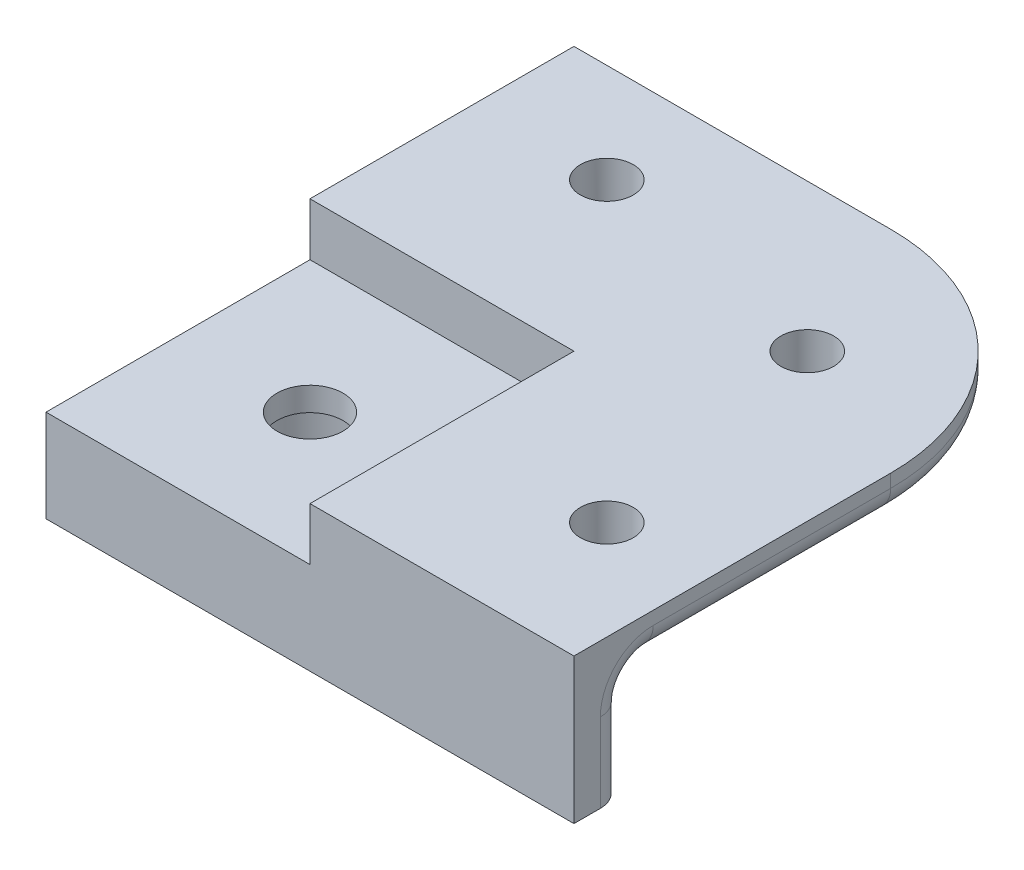
ISO-10303-21;
HEADER;
FILE_DESCRIPTION(('STEP AP214'),'2;1');
FILE_NAME('part.step','',(''),(''),'','','');
FILE_SCHEMA(('AUTOMOTIVE_DESIGN { 1 0 10303 214 1 1 1 1 }'));
ENDSEC;
DATA;
#1=APPLICATION_CONTEXT('core data for automotive mechanical design processes');
#2=APPLICATION_PROTOCOL_DEFINITION('international standard','automotive_design',2000,#1);
#3=PRODUCT_CONTEXT('',#1,'mechanical');
#4=PRODUCT('Part','Part','',(#3));
#5=PRODUCT_RELATED_PRODUCT_CATEGORY('part','',(#4));
#6=PRODUCT_DEFINITION_FORMATION('','',#4);
#7=PRODUCT_DEFINITION_CONTEXT('part definition',#1,'design');
#8=PRODUCT_DEFINITION('design','',#6,#7);
#9=PRODUCT_DEFINITION_SHAPE('','',#8);
#10=(LENGTH_UNIT() NAMED_UNIT(*) SI_UNIT(.MILLI.,.METRE.));
#11=(NAMED_UNIT(*) PLANE_ANGLE_UNIT() SI_UNIT($,.RADIAN.));
#12=(NAMED_UNIT(*) SI_UNIT($,.STERADIAN.) SOLID_ANGLE_UNIT());
#13=UNCERTAINTY_MEASURE_WITH_UNIT(LENGTH_MEASURE(1.E-05),#10,'distance_accuracy_value','');
#14=(GEOMETRIC_REPRESENTATION_CONTEXT(3) GLOBAL_UNCERTAINTY_ASSIGNED_CONTEXT((#13)) GLOBAL_UNIT_ASSIGNED_CONTEXT((#10,
#11,#12)) REPRESENTATION_CONTEXT('',''));
#15=CARTESIAN_POINT('',(0.,0.,0.));
#16=DIRECTION('',(0.,0.,1.));
#17=DIRECTION('',(1.,0.,0.));
#18=AXIS2_PLACEMENT_3D('',#15,#16,#17);
#19=CARTESIAN_POINT('',(0.,10.,0.));
#20=DIRECTION('',(0.,-1.,0.));
#21=DIRECTION('',(0.,0.,-1.));
#22=AXIS2_PLACEMENT_3D('',#19,#20,#21);
#23=CYLINDRICAL_SURFACE('',#22,2.5);
#24=CARTESIAN_POINT('',(0.,7.,0.));
#25=DIRECTION('',(0.,-1.,0.));
#26=DIRECTION('',(0.,0.,-1.));
#27=AXIS2_PLACEMENT_3D('',#24,#25,#26);
#28=CIRCLE('',#27,2.5);
#29=CARTESIAN_POINT('',(0.,7.,-2.5));
#30=VERTEX_POINT('',#29);
#31=EDGE_CURVE('E351',#30,#30,#28,.T.);
#32=ORIENTED_EDGE('',*,*,#31,.F.);
#33=EDGE_LOOP('',(#32));
#34=FACE_BOUND('',#33,.T.);
#35=CARTESIAN_POINT('',(0.,5.2,0.));
#36=DIRECTION('',(0.,-1.,0.));
#37=DIRECTION('',(0.,0.,-1.));
#38=AXIS2_PLACEMENT_3D('',#35,#36,#37);
#39=CIRCLE('',#38,2.5);
#40=CARTESIAN_POINT('',(0.,5.2,-2.5));
#41=VERTEX_POINT('',#40);
#42=EDGE_CURVE('E396',#41,#41,#39,.F.);
#43=ORIENTED_EDGE('',*,*,#42,.F.);
#44=EDGE_LOOP('',(#43));
#45=FACE_BOUND('',#44,.T.);
#46=ADVANCED_FACE('F34',(#34,#45),#23,.F.);
#47=CARTESIAN_POINT('',(0.,11.,6.));
#48=DIRECTION('',(0.,0.,-1.));
#49=DIRECTION('',(-1.,0.,0.));
#50=AXIS2_PLACEMENT_3D('',#47,#48,#49);
#51=PLANE('',#50);
#52=DIRECTION('',(-1.,0.,0.));
#53=VECTOR('',#52,1.);
#54=CARTESIAN_POINT('',(0.,6.,6.));
#55=LINE('',#54,#53);
#56=CARTESIAN_POINT('',(16.,6.,6.));
#57=VERTEX_POINT('',#56);
#58=CARTESIAN_POINT('',(28.,6.,6.));
#59=VERTEX_POINT('',#58);
#60=EDGE_CURVE('E286',#57,#59,#55,.F.);
#61=ORIENTED_EDGE('',*,*,#60,.T.);
#62=DIRECTION('',(0.,-1.,0.));
#63=VECTOR('',#62,1.);
#64=CARTESIAN_POINT('',(28.,0.,6.));
#65=LINE('',#64,#63);
#66=CARTESIAN_POINT('',(28.,0.,6.));
#67=VERTEX_POINT('',#66);
#68=EDGE_CURVE('E288',#59,#67,#65,.T.);
#69=ORIENTED_EDGE('',*,*,#68,.T.);
#70=DIRECTION('',(1.,0.,0.));
#71=VECTOR('',#70,1.);
#72=CARTESIAN_POINT('',(0.,0.,6.));
#73=LINE('',#72,#71);
#74=CARTESIAN_POINT('',(16.,0.,6.));
#75=VERTEX_POINT('',#74);
#76=EDGE_CURVE('E255',#75,#67,#73,.T.);
#77=ORIENTED_EDGE('',*,*,#76,.F.);
#78=DIRECTION('',(0.,-1.,0.));
#79=VECTOR('',#78,1.);
#80=CARTESIAN_POINT('',(16.,8.,6.));
#81=LINE('',#80,#79);
#82=EDGE_CURVE('E284',#75,#57,#81,.F.);
#83=ORIENTED_EDGE('',*,*,#82,.T.);
#84=EDGE_LOOP('',(#61,#69,#77,#83));
#85=FACE_BOUND('',#84,.T.);
#86=ADVANCED_FACE('F469',(#85),#51,.T.);
#87=CARTESIAN_POINT('',(14.,11.,0.));
#88=DIRECTION('',(1.,0.,0.));
#89=DIRECTION('',(0.,0.,-1.));
#90=AXIS2_PLACEMENT_3D('',#87,#88,#89);
#91=PLANE('',#90);
#92=DIRECTION('',(0.,0.,1.));
#93=VECTOR('',#92,1.);
#94=CARTESIAN_POINT('',(14.,0.,0.));
#95=LINE('',#94,#93);
#96=CARTESIAN_POINT('',(14.,0.,-12.));
#97=VERTEX_POINT('',#96);
#98=CARTESIAN_POINT('',(14.,0.,4.));
#99=VERTEX_POINT('',#98);
#100=EDGE_CURVE('E258',#97,#99,#95,.T.);
#101=ORIENTED_EDGE('',*,*,#100,.F.);
#102=DIRECTION('',(0.,-1.,0.));
#103=VECTOR('',#102,1.);
#104=CARTESIAN_POINT('',(14.,11.,-12.));
#105=LINE('',#104,#103);
#106=CARTESIAN_POINT('',(14.,6.,-12.));
#107=VERTEX_POINT('',#106);
#108=EDGE_CURVE('E338',#97,#107,#105,.F.);
#109=ORIENTED_EDGE('',*,*,#108,.T.);
#110=DIRECTION('',(0.,0.,-1.));
#111=VECTOR('',#110,1.);
#112=CARTESIAN_POINT('',(14.,6.,0.));
#113=LINE('',#112,#111);
#114=CARTESIAN_POINT('',(14.,6.,4.));
#115=VERTEX_POINT('',#114);
#116=EDGE_CURVE('E336',#107,#115,#113,.F.);
#117=ORIENTED_EDGE('',*,*,#116,.T.);
#118=DIRECTION('',(0.,-1.,0.));
#119=VECTOR('',#118,1.);
#120=CARTESIAN_POINT('',(14.,0.,4.));
#121=LINE('',#120,#119);
#122=EDGE_CURVE('E334',#115,#99,#121,.T.);
#123=ORIENTED_EDGE('',*,*,#122,.T.);
#124=EDGE_LOOP('',(#101,#109,#117,#123));
#125=FACE_BOUND('',#124,.T.);
#126=ADVANCED_FACE('F479',(#125),#91,.T.);
#127=CARTESIAN_POINT('',(0.,11.,-14.));
#128=DIRECTION('',(0.,0.,-1.));
#129=DIRECTION('',(-1.,0.,0.));
#130=AXIS2_PLACEMENT_3D('',#127,#128,#129);
#131=PLANE('',#130);
#132=DIRECTION('',(1.,0.,0.));
#133=VECTOR('',#132,1.);
#134=CARTESIAN_POINT('',(0.,0.,-14.));
#135=LINE('',#134,#133);
#136=CARTESIAN_POINT('',(-4.,0.,-14.));
#137=VERTEX_POINT('',#136);
#138=CARTESIAN_POINT('',(12.,0.,-14.));
#139=VERTEX_POINT('',#138);
#140=EDGE_CURVE('E261',#137,#139,#135,.T.);
#141=ORIENTED_EDGE('',*,*,#140,.F.);
#142=DIRECTION('',(0.,-1.,0.));
#143=VECTOR('',#142,1.);
#144=CARTESIAN_POINT('',(-4.,11.,-14.));
#145=LINE('',#144,#143);
#146=CARTESIAN_POINT('',(-4.,6.,-14.));
#147=VERTEX_POINT('',#146);
#148=EDGE_CURVE('E51',#137,#147,#145,.F.);
#149=ORIENTED_EDGE('',*,*,#148,.T.);
#150=DIRECTION('',(-1.,0.,0.));
#151=VECTOR('',#150,1.);
#152=CARTESIAN_POINT('',(0.,6.,-14.));
#153=LINE('',#152,#151);
#154=CARTESIAN_POINT('',(12.,6.,-14.));
#155=VERTEX_POINT('',#154);
#156=EDGE_CURVE('E56',#147,#155,#153,.F.);
#157=ORIENTED_EDGE('',*,*,#156,.T.);
#158=DIRECTION('',(0.,-1.,0.));
#159=VECTOR('',#158,1.);
#160=CARTESIAN_POINT('',(12.,11.,-14.));
#161=LINE('',#160,#159);
#162=EDGE_CURVE('E342',#155,#139,#161,.T.);
#163=ORIENTED_EDGE('',*,*,#162,.T.);
#164=EDGE_LOOP('',(#141,#149,#157,#163));
#165=FACE_BOUND('',#164,.T.);
#166=ADVANCED_FACE('F574',(#165),#131,.T.);
#167=CARTESIAN_POINT('',(-6.,11.,0.));
#168=DIRECTION('',(-1.,0.,0.));
#169=DIRECTION('',(0.,0.,1.));
#170=AXIS2_PLACEMENT_3D('',#167,#168,#169);
#171=PLANE('',#170);
#172=DIRECTION('',(0.,0.,-1.));
#173=VECTOR('',#172,1.);
#174=CARTESIAN_POINT('',(-6.,0.,0.));
#175=LINE('',#174,#173);
#176=CARTESIAN_POINT('',(-6.,0.,-16.));
#177=VERTEX_POINT('',#176);
#178=CARTESIAN_POINT('',(-6.,0.,-28.));
#179=VERTEX_POINT('',#178);
#180=EDGE_CURVE('E264',#177,#179,#175,.T.);
#181=ORIENTED_EDGE('',*,*,#180,.T.);
#182=DIRECTION('',(0.,-1.,0.));
#183=VECTOR('',#182,1.);
#184=CARTESIAN_POINT('',(-6.,8.,-28.));
#185=LINE('',#184,#183);
#186=CARTESIAN_POINT('',(-6.,6.,-28.));
#187=VERTEX_POINT('',#186);
#188=EDGE_CURVE('E314',#179,#187,#185,.F.);
#189=ORIENTED_EDGE('',*,*,#188,.T.);
#190=DIRECTION('',(0.,0.,-1.));
#191=VECTOR('',#190,1.);
#192=CARTESIAN_POINT('',(-6.,6.,-14.));
#193=LINE('',#192,#191);
#194=CARTESIAN_POINT('',(-6.,6.,-16.));
#195=VERTEX_POINT('',#194);
#196=EDGE_CURVE('E312',#187,#195,#193,.F.);
#197=ORIENTED_EDGE('',*,*,#196,.T.);
#198=DIRECTION('',(0.,-1.,0.));
#199=VECTOR('',#198,1.);
#200=CARTESIAN_POINT('',(-6.,11.,-16.));
#201=LINE('',#200,#199);
#202=EDGE_CURVE('E310',#195,#177,#201,.T.);
#203=ORIENTED_EDGE('',*,*,#202,.T.);
#204=EDGE_LOOP('',(#181,#189,#197,#203));
#205=FACE_BOUND('',#204,.T.);
#206=ADVANCED_FACE('F538',(#205),#171,.F.);
#207=CARTESIAN_POINT('',(0.,11.,-10.));
#208=DIRECTION('',(0.,0.,1.));
#209=DIRECTION('',(1.,0.,0.));
#210=AXIS2_PLACEMENT_3D('',#207,#208,#209);
#211=PLANE('',#210);
#212=DIRECTION('',(0.,-1.,0.));
#213=VECTOR('',#212,1.);
#214=CARTESIAN_POINT('',(-10.,11.,-10.));
#215=LINE('',#214,#213);
#216=CARTESIAN_POINT('',(-10.,11.,-10.));
#217=VERTEX_POINT('',#216);
#218=CARTESIAN_POINT('',(-10.,7.,-10.));
#219=VERTEX_POINT('',#218);
#220=EDGE_CURVE('E251',#217,#219,#215,.T.);
#221=ORIENTED_EDGE('',*,*,#220,.T.);
#222=DIRECTION('',(-1.,0.,0.));
#223=VECTOR('',#222,1.);
#224=CARTESIAN_POINT('',(-10.,7.,-10.));
#225=LINE('',#224,#223);
#226=CARTESIAN_POINT('',(10.,7.,-10.));
#227=VERTEX_POINT('',#226);
#228=EDGE_CURVE('E229',#227,#219,#225,.T.);
#229=ORIENTED_EDGE('',*,*,#228,.F.);
#230=DIRECTION('',(0.,-1.,0.));
#231=VECTOR('',#230,1.);
#232=CARTESIAN_POINT('',(10.,11.,-10.));
#233=LINE('',#232,#231);
#234=CARTESIAN_POINT('',(10.,11.,-10.));
#235=VERTEX_POINT('',#234);
#236=EDGE_CURVE('E281',#235,#227,#233,.T.);
#237=ORIENTED_EDGE('',*,*,#236,.F.);
#238=DIRECTION('',(-1.,0.,0.));
#239=VECTOR('',#238,1.);
#240=CARTESIAN_POINT('',(0.,11.,-10.));
#241=LINE('',#240,#239);
#242=EDGE_CURVE('E239',#235,#217,#241,.T.);
#243=ORIENTED_EDGE('',*,*,#242,.T.);
#244=EDGE_LOOP('',(#221,#229,#237,#243));
#245=FACE_BOUND('',#244,.T.);
#246=ADVANCED_FACE('F573',(#245),#211,.T.);
#247=CARTESIAN_POINT('',(10.,11.,0.));
#248=DIRECTION('',(-1.,0.,0.));
#249=DIRECTION('',(0.,0.,1.));
#250=AXIS2_PLACEMENT_3D('',#247,#248,#249);
#251=PLANE('',#250);
#252=ORIENTED_EDGE('',*,*,#236,.T.);
#253=DIRECTION('',(0.,0.,-1.));
#254=VECTOR('',#253,1.);
#255=CARTESIAN_POINT('',(10.,7.,10.));
#256=LINE('',#255,#254);
#257=CARTESIAN_POINT('',(10.,7.,10.));
#258=VERTEX_POINT('',#257);
#259=EDGE_CURVE('E226',#258,#227,#256,.T.);
#260=ORIENTED_EDGE('',*,*,#259,.F.);
#261=DIRECTION('',(0.,-1.,0.));
#262=VECTOR('',#261,1.);
#263=CARTESIAN_POINT('',(10.,11.,10.));
#264=LINE('',#263,#262);
#265=CARTESIAN_POINT('',(10.,11.,10.));
#266=VERTEX_POINT('',#265);
#267=EDGE_CURVE('E278',#266,#258,#264,.T.);
#268=ORIENTED_EDGE('',*,*,#267,.F.);
#269=DIRECTION('',(0.,0.,-1.));
#270=VECTOR('',#269,1.);
#271=CARTESIAN_POINT('',(10.,11.,0.));
#272=LINE('',#271,#270);
#273=EDGE_CURVE('E242',#266,#235,#272,.T.);
#274=ORIENTED_EDGE('',*,*,#273,.T.);
#275=EDGE_LOOP('',(#252,#260,#268,#274));
#276=FACE_BOUND('',#275,.T.);
#277=ADVANCED_FACE('F583',(#276),#251,.T.);
#278=CARTESIAN_POINT('',(0.,11.,10.));
#279=DIRECTION('',(0.,0.,-1.));
#280=DIRECTION('',(-1.,0.,0.));
#281=AXIS2_PLACEMENT_3D('',#278,#279,#280);
#282=PLANE('',#281);
#283=DIRECTION('',(1.,0.,0.));
#284=VECTOR('',#283,1.);
#285=CARTESIAN_POINT('',(0.,0.,10.));
#286=LINE('',#285,#284);
#287=CARTESIAN_POINT('',(-10.,0.,10.));
#288=VERTEX_POINT('',#287);
#289=CARTESIAN_POINT('',(30.,0.,10.));
#290=VERTEX_POINT('',#289);
#291=EDGE_CURVE('E238',#288,#290,#286,.T.);
#292=ORIENTED_EDGE('',*,*,#291,.T.);
#293=DIRECTION('',(0.,-1.,0.));
#294=VECTOR('',#293,1.);
#295=CARTESIAN_POINT('',(30.,11.,10.));
#296=LINE('',#295,#294);
#297=CARTESIAN_POINT('',(30.,11.,10.));
#298=VERTEX_POINT('',#297);
#299=EDGE_CURVE('E276',#298,#290,#296,.T.);
#300=ORIENTED_EDGE('',*,*,#299,.F.);
#301=DIRECTION('',(1.,0.,0.));
#302=VECTOR('',#301,1.);
#303=CARTESIAN_POINT('',(0.,11.,10.));
#304=LINE('',#303,#302);
#305=EDGE_CURVE('E210',#266,#298,#304,.T.);
#306=ORIENTED_EDGE('',*,*,#305,.F.);
#307=ORIENTED_EDGE('',*,*,#267,.T.);
#308=DIRECTION('',(1.,0.,0.));
#309=VECTOR('',#308,1.);
#310=CARTESIAN_POINT('',(-10.,7.,10.));
#311=LINE('',#310,#309);
#312=CARTESIAN_POINT('',(-10.,7.,10.));
#313=VERTEX_POINT('',#312);
#314=EDGE_CURVE('E233',#313,#258,#311,.T.);
#315=ORIENTED_EDGE('',*,*,#314,.F.);
#316=DIRECTION('',(0.,-1.,0.));
#317=VECTOR('',#316,1.);
#318=CARTESIAN_POINT('',(-10.,7.,10.));
#319=LINE('',#318,#317);
#320=EDGE_CURVE('E235',#313,#288,#319,.T.);
#321=ORIENTED_EDGE('',*,*,#320,.T.);
#322=EDGE_LOOP('',(#292,#300,#306,#307,#315,#321));
#323=FACE_BOUND('',#322,.T.);
#324=ADVANCED_FACE('F520',(#323),#282,.F.);
#325=CARTESIAN_POINT('',(30.,11.,0.));
#326=DIRECTION('',(-1.,0.,0.));
#327=DIRECTION('',(0.,0.,1.));
#328=AXIS2_PLACEMENT_3D('',#325,#326,#327);
#329=PLANE('',#328);
#330=DIRECTION('',(0.,0.,-1.));
#331=VECTOR('',#330,1.);
#332=CARTESIAN_POINT('',(30.,0.,0.));
#333=LINE('',#332,#331);
#334=CARTESIAN_POINT('',(30.,0.,8.));
#335=VERTEX_POINT('',#334);
#336=EDGE_CURVE('E253',#290,#335,#333,.T.);
#337=ORIENTED_EDGE('',*,*,#336,.T.);
#338=DIRECTION('',(0.,-1.,0.));
#339=VECTOR('',#338,1.);
#340=CARTESIAN_POINT('',(30.,8.,8.));
#341=LINE('',#340,#339);
#342=CARTESIAN_POINT('',(30.,6.,8.));
#343=VERTEX_POINT('',#342);
#344=EDGE_CURVE('E301',#335,#343,#341,.F.);
#345=ORIENTED_EDGE('',*,*,#344,.T.);
#346=CARTESIAN_POINT('',(30.,6.,4.));
#347=DIRECTION('',(-1.,0.,0.));
#348=DIRECTION('',(0.,0.,1.));
#349=AXIS2_PLACEMENT_3D('',#346,#347,#348);
#350=CIRCLE('',#349,4.);
#351=CARTESIAN_POINT('',(30.,10.,4.));
#352=VERTEX_POINT('',#351);
#353=EDGE_CURVE('E298',#352,#343,#350,.F.);
#354=ORIENTED_EDGE('',*,*,#353,.F.);
#355=DIRECTION('',(0.,0.,-1.));
#356=VECTOR('',#355,1.);
#357=CARTESIAN_POINT('',(30.,10.,0.));
#358=LINE('',#357,#356);
#359=CARTESIAN_POINT('',(30.,10.,-14.));
#360=VERTEX_POINT('',#359);
#361=EDGE_CURVE('E197',#352,#360,#358,.T.);
#362=ORIENTED_EDGE('',*,*,#361,.T.);
#363=DIRECTION('',(0.,1.,0.));
#364=VECTOR('',#363,1.);
#365=CARTESIAN_POINT('',(30.,8.,-14.));
#366=LINE('',#365,#364);
#367=CARTESIAN_POINT('',(30.,11.,-14.));
#368=VERTEX_POINT('',#367);
#369=EDGE_CURVE('E190',#360,#368,#366,.T.);
#370=ORIENTED_EDGE('',*,*,#369,.T.);
#371=DIRECTION('',(0.,0.,-1.));
#372=VECTOR('',#371,1.);
#373=CARTESIAN_POINT('',(30.,11.,0.));
#374=LINE('',#373,#372);
#375=EDGE_CURVE('E195',#298,#368,#374,.T.);
#376=ORIENTED_EDGE('',*,*,#375,.F.);
#377=ORIENTED_EDGE('',*,*,#299,.T.);
#378=EDGE_LOOP('',(#337,#345,#354,#362,#370,#376,#377));
#379=FACE_BOUND('',#378,.T.);
#380=ADVANCED_FACE('F193',(#379),#329,.F.);
#381=CARTESIAN_POINT('',(0.,11.,-30.));
#382=DIRECTION('',(0.,0.,-1.));
#383=DIRECTION('',(-1.,0.,0.));
#384=AXIS2_PLACEMENT_3D('',#381,#382,#383);
#385=PLANE('',#384);
#386=CARTESIAN_POINT('',(-4.,6.,-30.));
#387=DIRECTION('',(0.,0.,-1.));
#388=DIRECTION('',(-1.,0.,0.));
#389=AXIS2_PLACEMENT_3D('',#386,#387,#388);
#390=CIRCLE('',#389,4.);
#391=CARTESIAN_POINT('',(-8.,6.,-30.));
#392=VERTEX_POINT('',#391);
#393=CARTESIAN_POINT('',(-4.,10.,-30.));
#394=VERTEX_POINT('',#393);
#395=EDGE_CURVE('E303',#392,#394,#390,.T.);
#396=ORIENTED_EDGE('',*,*,#395,.F.);
#397=DIRECTION('',(0.,-1.,0.));
#398=VECTOR('',#397,1.);
#399=CARTESIAN_POINT('',(-8.,0.,-30.));
#400=LINE('',#399,#398);
#401=CARTESIAN_POINT('',(-8.,0.,-30.));
#402=VERTEX_POINT('',#401);
#403=EDGE_CURVE('E308',#392,#402,#400,.T.);
#404=ORIENTED_EDGE('',*,*,#403,.T.);
#405=DIRECTION('',(1.,0.,0.));
#406=VECTOR('',#405,1.);
#407=CARTESIAN_POINT('',(0.,0.,-30.));
#408=LINE('',#407,#406);
#409=CARTESIAN_POINT('',(-10.,0.,-30.));
#410=VERTEX_POINT('',#409);
#411=EDGE_CURVE('E267',#410,#402,#408,.T.);
#412=ORIENTED_EDGE('',*,*,#411,.F.);
#413=DIRECTION('',(0.,-1.,0.));
#414=VECTOR('',#413,1.);
#415=CARTESIAN_POINT('',(-10.,11.,-30.));
#416=LINE('',#415,#414);
#417=CARTESIAN_POINT('',(-10.,11.,-30.));
#418=VERTEX_POINT('',#417);
#419=EDGE_CURVE('E274',#418,#410,#416,.T.);
#420=ORIENTED_EDGE('',*,*,#419,.F.);
#421=DIRECTION('',(1.,0.,0.));
#422=VECTOR('',#421,1.);
#423=CARTESIAN_POINT('',(0.,11.,-30.));
#424=LINE('',#423,#422);
#425=CARTESIAN_POINT('',(14.,11.,-30.));
#426=VERTEX_POINT('',#425);
#427=EDGE_CURVE('E212',#418,#426,#424,.T.);
#428=ORIENTED_EDGE('',*,*,#427,.T.);
#429=DIRECTION('',(0.,1.,0.));
#430=VECTOR('',#429,1.);
#431=CARTESIAN_POINT('',(14.,8.,-30.));
#432=LINE('',#431,#430);
#433=CARTESIAN_POINT('',(14.,10.,-30.));
#434=VERTEX_POINT('',#433);
#435=EDGE_CURVE('E201',#434,#426,#432,.T.);
#436=ORIENTED_EDGE('',*,*,#435,.F.);
#437=DIRECTION('',(1.,0.,0.));
#438=VECTOR('',#437,1.);
#439=CARTESIAN_POINT('',(-6.,10.,-30.));
#440=LINE('',#439,#438);
#441=EDGE_CURVE('E306',#434,#394,#440,.F.);
#442=ORIENTED_EDGE('',*,*,#441,.T.);
#443=EDGE_LOOP('',(#396,#404,#412,#420,#428,#436,#442));
#444=FACE_BOUND('',#443,.T.);
#445=ADVANCED_FACE('F529',(#444),#385,.T.);
#446=CARTESIAN_POINT('',(-10.,11.,0.));
#447=DIRECTION('',(-1.,0.,0.));
#448=DIRECTION('',(0.,0.,1.));
#449=AXIS2_PLACEMENT_3D('',#446,#447,#448);
#450=PLANE('',#449);
#451=DIRECTION('',(0.,0.,-1.));
#452=VECTOR('',#451,1.);
#453=CARTESIAN_POINT('',(-10.,0.,0.));
#454=LINE('',#453,#452);
#455=EDGE_CURVE('E243',#288,#410,#454,.T.);
#456=ORIENTED_EDGE('',*,*,#455,.F.);
#457=ORIENTED_EDGE('',*,*,#320,.F.);
#458=DIRECTION('',(0.,0.,1.));
#459=VECTOR('',#458,1.);
#460=CARTESIAN_POINT('',(-10.,7.,10.));
#461=LINE('',#460,#459);
#462=EDGE_CURVE('E231',#219,#313,#461,.T.);
#463=ORIENTED_EDGE('',*,*,#462,.F.);
#464=ORIENTED_EDGE('',*,*,#220,.F.);
#465=DIRECTION('',(0.,0.,-1.));
#466=VECTOR('',#465,1.);
#467=CARTESIAN_POINT('',(-10.,11.,0.));
#468=LINE('',#467,#466);
#469=EDGE_CURVE('E248',#217,#418,#468,.T.);
#470=ORIENTED_EDGE('',*,*,#469,.T.);
#471=ORIENTED_EDGE('',*,*,#419,.T.);
#472=EDGE_LOOP('',(#456,#457,#463,#464,#470,#471));
#473=FACE_BOUND('',#472,.T.);
#474=ADVANCED_FACE('F432',(#473),#450,.T.);
#475=CARTESIAN_POINT('',(0.,11.,0.));
#476=DIRECTION('',(0.,1.,0.));
#477=DIRECTION('',(0.,0.,1.));
#478=AXIS2_PLACEMENT_3D('',#475,#476,#477);
#479=PLANE('',#478);
#480=CARTESIAN_POINT('',(22.4899959967968,11.,0.));
#481=DIRECTION('',(0.,1.,0.));
#482=DIRECTION('',(0.,0.,1.));
#483=AXIS2_PLACEMENT_3D('',#480,#481,#482);
#484=CIRCLE('',#483,2.);
#485=CARTESIAN_POINT('',(22.4899959967968,11.,2.));
#486=VERTEX_POINT('',#485);
#487=EDGE_CURVE('E403',#486,#486,#484,.T.);
#488=ORIENTED_EDGE('',*,*,#487,.F.);
#489=EDGE_LOOP('',(#488));
#490=FACE_BOUND('',#489,.T.);
#491=CARTESIAN_POINT('',(0.,11.,-22.4899959967968));
#492=DIRECTION('',(0.,1.,0.));
#493=DIRECTION('',(0.,0.,-1.));
#494=AXIS2_PLACEMENT_3D('',#491,#492,#493);
#495=CIRCLE('',#494,2.00000000000001);
#496=CARTESIAN_POINT('',(0.,11.,-24.4899959967968));
#497=VERTEX_POINT('',#496);
#498=EDGE_CURVE('E420',#497,#497,#495,.T.);
#499=ORIENTED_EDGE('',*,*,#498,.F.);
#500=EDGE_LOOP('',(#499));
#501=FACE_BOUND('',#500,.T.);
#502=CARTESIAN_POINT('',(18.8388347648318,11.,-18.8388347648318));
#503=DIRECTION('',(0.,1.,0.));
#504=DIRECTION('',(0.,0.,1.));
#505=AXIS2_PLACEMENT_3D('',#502,#503,#504);
#506=CIRCLE('',#505,2.);
#507=CARTESIAN_POINT('',(18.8388347648318,11.,-16.8388347648318));
#508=VERTEX_POINT('',#507);
#509=EDGE_CURVE('E417',#508,#508,#506,.T.);
#510=ORIENTED_EDGE('',*,*,#509,.F.);
#511=EDGE_LOOP('',(#510));
#512=FACE_BOUND('',#511,.T.);
#513=CARTESIAN_POINT('',(14.,11.,-14.));
#514=DIRECTION('',(0.,1.,0.));
#515=DIRECTION('',(0.,0.,1.));
#516=AXIS2_PLACEMENT_3D('',#513,#514,#515);
#517=CIRCLE('',#516,16.);
#518=EDGE_CURVE('E202',#368,#426,#517,.T.);
#519=ORIENTED_EDGE('',*,*,#518,.T.);
#520=ORIENTED_EDGE('',*,*,#427,.F.);
#521=ORIENTED_EDGE('',*,*,#469,.F.);
#522=ORIENTED_EDGE('',*,*,#242,.F.);
#523=ORIENTED_EDGE('',*,*,#273,.F.);
#524=ORIENTED_EDGE('',*,*,#305,.T.);
#525=ORIENTED_EDGE('',*,*,#375,.T.);
#526=EDGE_LOOP('',(#519,#520,#521,#522,#523,#524,#525));
#527=FACE_BOUND('',#526,.T.);
#528=ADVANCED_FACE('F206',(#490,#501,#512,#527),#479,.T.);
#529=CARTESIAN_POINT('',(0.,0.,0.));
#530=DIRECTION('',(0.,1.,0.));
#531=DIRECTION('',(0.,0.,1.));
#532=AXIS2_PLACEMENT_3D('',#529,#530,#531);
#533=PLANE('',#532);
#534=CARTESIAN_POINT('',(0.,0.,0.));
#535=DIRECTION('',(0.,-1.,0.));
#536=DIRECTION('',(0.,0.,-1.));
#537=AXIS2_PLACEMENT_3D('',#534,#535,#536);
#538=CIRCLE('',#537,4.25);
#539=CARTESIAN_POINT('',(0.,0.,-4.25));
#540=VERTEX_POINT('',#539);
#541=EDGE_CURVE('E224',#540,#540,#538,.T.);
#542=ORIENTED_EDGE('',*,*,#541,.F.);
#543=EDGE_LOOP('',(#542));
#544=FACE_BOUND('',#543,.T.);
#545=ORIENTED_EDGE('',*,*,#76,.T.);
#546=CARTESIAN_POINT('',(28.,0.,8.));
#547=DIRECTION('',(0.,1.,0.));
#548=DIRECTION('',(0.,0.,1.));
#549=AXIS2_PLACEMENT_3D('',#546,#547,#548);
#550=CIRCLE('',#549,2.);
#551=EDGE_CURVE('E295',#67,#335,#550,.F.);
#552=ORIENTED_EDGE('',*,*,#551,.T.);
#553=ORIENTED_EDGE('',*,*,#336,.F.);
#554=ORIENTED_EDGE('',*,*,#291,.F.);
#555=ORIENTED_EDGE('',*,*,#455,.T.);
#556=ORIENTED_EDGE('',*,*,#411,.T.);
#557=CARTESIAN_POINT('',(-8.,0.,-28.));
#558=DIRECTION('',(0.,1.,0.));
#559=DIRECTION('',(0.,0.,1.));
#560=AXIS2_PLACEMENT_3D('',#557,#558,#559);
#561=CIRCLE('',#560,2.);
#562=EDGE_CURVE('E293',#402,#179,#561,.F.);
#563=ORIENTED_EDGE('',*,*,#562,.T.);
#564=ORIENTED_EDGE('',*,*,#180,.F.);
#565=CARTESIAN_POINT('',(-4.,0.,-16.));
#566=DIRECTION('',(0.,1.,0.));
#567=DIRECTION('',(0.,0.,1.));
#568=AXIS2_PLACEMENT_3D('',#565,#566,#567);
#569=CIRCLE('',#568,2.);
#570=EDGE_CURVE('E43',#177,#137,#569,.T.);
#571=ORIENTED_EDGE('',*,*,#570,.T.);
#572=ORIENTED_EDGE('',*,*,#140,.T.);
#573=CARTESIAN_POINT('',(12.,0.,-12.));
#574=DIRECTION('',(0.,1.,0.));
#575=DIRECTION('',(0.,0.,1.));
#576=AXIS2_PLACEMENT_3D('',#573,#574,#575);
#577=CIRCLE('',#576,2.);
#578=EDGE_CURVE('E291',#139,#97,#577,.F.);
#579=ORIENTED_EDGE('',*,*,#578,.T.);
#580=ORIENTED_EDGE('',*,*,#100,.T.);
#581=CARTESIAN_POINT('',(16.,0.,4.));
#582=DIRECTION('',(0.,1.,0.));
#583=DIRECTION('',(0.,0.,1.));
#584=AXIS2_PLACEMENT_3D('',#581,#582,#583);
#585=CIRCLE('',#584,2.);
#586=EDGE_CURVE('E11',#99,#75,#585,.T.);
#587=ORIENTED_EDGE('',*,*,#586,.T.);
#588=EDGE_LOOP('',(#545,#552,#553,#554,#555,#556,#563,#564,#571,#572,#579,#580,#587));
#589=FACE_BOUND('',#588,.T.);
#590=ADVANCED_FACE('F431',(#544,#589),#533,.F.);
#591=CARTESIAN_POINT('',(0.,7.,0.));
#592=DIRECTION('',(0.,-1.,0.));
#593=DIRECTION('',(0.,0.,-1.));
#594=AXIS2_PLACEMENT_3D('',#591,#592,#593);
#595=PLANE('',#594);
#596=ORIENTED_EDGE('',*,*,#31,.T.);
#597=EDGE_LOOP('',(#596));
#598=FACE_BOUND('',#597,.T.);
#599=ORIENTED_EDGE('',*,*,#259,.T.);
#600=ORIENTED_EDGE('',*,*,#228,.T.);
#601=ORIENTED_EDGE('',*,*,#462,.T.);
#602=ORIENTED_EDGE('',*,*,#314,.T.);
#603=EDGE_LOOP('',(#599,#600,#601,#602));
#604=FACE_BOUND('',#603,.T.);
#605=ADVANCED_FACE('F560',(#598,#604),#595,.F.);
#606=CARTESIAN_POINT('',(14.,8.,-14.));
#607=DIRECTION('',(0.,1.,0.));
#608=DIRECTION('',(0.,0.,1.));
#609=AXIS2_PLACEMENT_3D('',#606,#607,#608);
#610=CYLINDRICAL_SURFACE('',#609,16.);
#611=ORIENTED_EDGE('',*,*,#369,.F.);
#612=CARTESIAN_POINT('',(14.,10.,-14.));
#613=DIRECTION('',(0.,1.,0.));
#614=DIRECTION('',(0.,0.,1.));
#615=AXIS2_PLACEMENT_3D('',#612,#613,#614);
#616=CIRCLE('',#615,16.);
#617=EDGE_CURVE('E340',#360,#434,#616,.T.);
#618=ORIENTED_EDGE('',*,*,#617,.T.);
#619=ORIENTED_EDGE('',*,*,#435,.T.);
#620=ORIENTED_EDGE('',*,*,#518,.F.);
#621=EDGE_LOOP('',(#611,#618,#619,#620));
#622=FACE_BOUND('',#621,.T.);
#623=ADVANCED_FACE('F214',(#622),#610,.T.);
#624=CARTESIAN_POINT('',(0.,8.,0.));
#625=DIRECTION('',(0.,1.,0.));
#626=DIRECTION('',(0.,0.,1.));
#627=AXIS2_PLACEMENT_3D('',#624,#625,#626);
#628=PLANE('',#627);
#629=CARTESIAN_POINT('',(22.4899959967968,8.,0.));
#630=DIRECTION('',(0.,1.,0.));
#631=DIRECTION('',(0.,0.,1.));
#632=AXIS2_PLACEMENT_3D('',#629,#630,#631);
#633=CIRCLE('',#632,2.);
#634=CARTESIAN_POINT('',(22.4899959967968,8.,2.));
#635=VERTEX_POINT('',#634);
#636=EDGE_CURVE('E38',#635,#635,#633,.T.);
#637=ORIENTED_EDGE('',*,*,#636,.T.);
#638=EDGE_LOOP('',(#637));
#639=FACE_BOUND('',#638,.T.);
#640=CARTESIAN_POINT('',(0.,8.,-22.4899959967968));
#641=DIRECTION('',(0.,1.,0.));
#642=DIRECTION('',(0.,0.,1.));
#643=AXIS2_PLACEMENT_3D('',#640,#641,#642);
#644=CIRCLE('',#643,2.00000000000001);
#645=CARTESIAN_POINT('',(0.,8.,-20.4899959967968));
#646=VERTEX_POINT('',#645);
#647=EDGE_CURVE('E402',#646,#646,#644,.T.);
#648=ORIENTED_EDGE('',*,*,#647,.T.);
#649=EDGE_LOOP('',(#648));
#650=FACE_BOUND('',#649,.T.);
#651=CARTESIAN_POINT('',(18.8388347648318,8.,-18.8388347648318));
#652=DIRECTION('',(0.,1.,0.));
#653=DIRECTION('',(0.,0.,1.));
#654=AXIS2_PLACEMENT_3D('',#651,#652,#653);
#655=CIRCLE('',#654,2.);
#656=CARTESIAN_POINT('',(18.8388347648318,8.,-16.8388347648318));
#657=VERTEX_POINT('',#656);
#658=EDGE_CURVE('E400',#657,#657,#655,.T.);
#659=ORIENTED_EDGE('',*,*,#658,.T.);
#660=EDGE_LOOP('',(#659));
#661=FACE_BOUND('',#660,.T.);
#662=DIRECTION('',(-1.,0.,0.));
#663=VECTOR('',#662,1.);
#664=CARTESIAN_POINT('',(0.,8.,4.));
#665=LINE('',#664,#663);
#666=CARTESIAN_POINT('',(28.,8.,4.));
#667=VERTEX_POINT('',#666);
#668=CARTESIAN_POINT('',(16.,8.,4.));
#669=VERTEX_POINT('',#668);
#670=EDGE_CURVE('E326',#667,#669,#665,.T.);
#671=ORIENTED_EDGE('',*,*,#670,.T.);
#672=DIRECTION('',(0.,0.,-1.));
#673=VECTOR('',#672,1.);
#674=CARTESIAN_POINT('',(16.,8.,0.));
#675=LINE('',#674,#673);
#676=CARTESIAN_POINT('',(16.,8.,-12.));
#677=VERTEX_POINT('',#676);
#678=EDGE_CURVE('E331',#669,#677,#675,.T.);
#679=ORIENTED_EDGE('',*,*,#678,.T.);
#680=CARTESIAN_POINT('',(12.,8.,-12.));
#681=DIRECTION('',(0.,1.,0.));
#682=DIRECTION('',(0.,0.,1.));
#683=AXIS2_PLACEMENT_3D('',#680,#681,#682);
#684=CIRCLE('',#683,4.);
#685=CARTESIAN_POINT('',(12.,8.,-16.));
#686=VERTEX_POINT('',#685);
#687=EDGE_CURVE('E328',#686,#677,#684,.F.);
#688=ORIENTED_EDGE('',*,*,#687,.F.);
#689=DIRECTION('',(-1.,0.,0.));
#690=VECTOR('',#689,1.);
#691=CARTESIAN_POINT('',(0.,8.,-16.));
#692=LINE('',#691,#690);
#693=CARTESIAN_POINT('',(-4.,8.,-16.));
#694=VERTEX_POINT('',#693);
#695=EDGE_CURVE('E316',#686,#694,#692,.T.);
#696=ORIENTED_EDGE('',*,*,#695,.T.);
#697=DIRECTION('',(0.,0.,-1.));
#698=VECTOR('',#697,1.);
#699=CARTESIAN_POINT('',(-4.,8.,-30.));
#700=LINE('',#699,#698);
#701=CARTESIAN_POINT('',(-4.,8.,-28.));
#702=VERTEX_POINT('',#701);
#703=EDGE_CURVE('E318',#694,#702,#700,.T.);
#704=ORIENTED_EDGE('',*,*,#703,.T.);
#705=DIRECTION('',(1.,0.,0.));
#706=VECTOR('',#705,1.);
#707=CARTESIAN_POINT('',(14.,8.,-28.));
#708=LINE('',#707,#706);
#709=CARTESIAN_POINT('',(14.,8.,-28.));
#710=VERTEX_POINT('',#709);
#711=EDGE_CURVE('E320',#702,#710,#708,.T.);
#712=ORIENTED_EDGE('',*,*,#711,.T.);
#713=CARTESIAN_POINT('',(14.,8.,-14.));
#714=DIRECTION('',(0.,1.,0.));
#715=DIRECTION('',(0.,0.,1.));
#716=AXIS2_PLACEMENT_3D('',#713,#714,#715);
#717=CIRCLE('',#716,14.);
#718=CARTESIAN_POINT('',(28.,8.,-14.));
#719=VERTEX_POINT('',#718);
#720=EDGE_CURVE('E322',#710,#719,#717,.F.);
#721=ORIENTED_EDGE('',*,*,#720,.T.);
#722=DIRECTION('',(0.,0.,-1.));
#723=VECTOR('',#722,1.);
#724=CARTESIAN_POINT('',(28.,8.,0.));
#725=LINE('',#724,#723);
#726=EDGE_CURVE('E324',#719,#667,#725,.F.);
#727=ORIENTED_EDGE('',*,*,#726,.T.);
#728=EDGE_LOOP('',(#671,#679,#688,#696,#704,#712,#721,#727));
#729=FACE_BOUND('',#728,.T.);
#730=ADVANCED_FACE('F446',(#639,#650,#661,#729),#628,.F.);
#731=CARTESIAN_POINT('',(-4.,11.,-16.));
#732=DIRECTION('',(0.,-1.,0.));
#733=DIRECTION('',(0.,0.,-1.));
#734=AXIS2_PLACEMENT_3D('',#731,#732,#733);
#735=CYLINDRICAL_SURFACE('',#734,2.);
#736=CARTESIAN_POINT('',(-4.,6.,-16.));
#737=DIRECTION('',(0.,-1.,0.));
#738=DIRECTION('',(0.,0.,-1.));
#739=AXIS2_PLACEMENT_3D('',#736,#737,#738);
#740=CIRCLE('',#739,2.);
#741=EDGE_CURVE('E217',#147,#195,#740,.T.);
#742=ORIENTED_EDGE('',*,*,#741,.F.);
#743=ORIENTED_EDGE('',*,*,#148,.F.);
#744=ORIENTED_EDGE('',*,*,#570,.F.);
#745=ORIENTED_EDGE('',*,*,#202,.F.);
#746=EDGE_LOOP('',(#742,#743,#744,#745));
#747=FACE_BOUND('',#746,.T.);
#748=ADVANCED_FACE('F36',(#747),#735,.F.);
#749=CARTESIAN_POINT('',(-4.,6.,-16.));
#750=DIRECTION('',(0.,0.,1.));
#751=DIRECTION('',(1.,0.,0.));
#752=AXIS2_PLACEMENT_3D('',#749,#750,#751);
#753=SPHERICAL_SURFACE('',#752,2.);
#754=CARTESIAN_POINT('',(-4.,6.,-16.));
#755=DIRECTION('',(1.,0.,0.));
#756=DIRECTION('',(0.,0.,-1.));
#757=AXIS2_PLACEMENT_3D('',#754,#755,#756);
#758=CIRCLE('',#757,2.);
#759=EDGE_CURVE('E389',#147,#694,#758,.F.);
#760=ORIENTED_EDGE('',*,*,#759,.F.);
#761=ORIENTED_EDGE('',*,*,#741,.T.);
#762=CARTESIAN_POINT('',(-4.,6.,-16.));
#763=DIRECTION('',(0.,0.,-1.));
#764=DIRECTION('',(-1.,0.,0.));
#765=AXIS2_PLACEMENT_3D('',#762,#763,#764);
#766=CIRCLE('',#765,2.);
#767=EDGE_CURVE('E220',#694,#195,#766,.F.);
#768=ORIENTED_EDGE('',*,*,#767,.F.);
#769=EDGE_LOOP('',(#760,#761,#768));
#770=FACE_BOUND('',#769,.T.);
#771=ADVANCED_FACE('F496',(#770),#753,.F.);
#772=CARTESIAN_POINT('',(-8.,11.,-28.));
#773=DIRECTION('',(0.,1.,0.));
#774=DIRECTION('',(0.,0.,1.));
#775=AXIS2_PLACEMENT_3D('',#772,#773,#774);
#776=CYLINDRICAL_SURFACE('',#775,2.);
#777=ORIENTED_EDGE('',*,*,#562,.F.);
#778=ORIENTED_EDGE('',*,*,#403,.F.);
#779=CARTESIAN_POINT('',(-8.,6.,-28.));
#780=DIRECTION('',(0.,1.,0.));
#781=DIRECTION('',(0.,0.,1.));
#782=AXIS2_PLACEMENT_3D('',#779,#780,#781);
#783=CIRCLE('',#782,2.);
#784=EDGE_CURVE('E386',#187,#392,#783,.T.);
#785=ORIENTED_EDGE('',*,*,#784,.F.);
#786=ORIENTED_EDGE('',*,*,#188,.F.);
#787=EDGE_LOOP('',(#777,#778,#785,#786));
#788=FACE_BOUND('',#787,.T.);
#789=ADVANCED_FACE('F535',(#788),#776,.T.);
#790=CARTESIAN_POINT('',(-4.,6.,0.));
#791=DIRECTION('',(0.,0.,1.));
#792=DIRECTION('',(1.,0.,0.));
#793=AXIS2_PLACEMENT_3D('',#790,#791,#792);
#794=CYLINDRICAL_SURFACE('',#793,2.);
#795=ORIENTED_EDGE('',*,*,#767,.T.);
#796=ORIENTED_EDGE('',*,*,#196,.F.);
#797=CARTESIAN_POINT('',(-4.,6.,-28.));
#798=DIRECTION('',(0.,0.,-1.));
#799=DIRECTION('',(-1.,0.,0.));
#800=AXIS2_PLACEMENT_3D('',#797,#798,#799);
#801=CIRCLE('',#800,2.);
#802=EDGE_CURVE('E383',#702,#187,#801,.F.);
#803=ORIENTED_EDGE('',*,*,#802,.F.);
#804=ORIENTED_EDGE('',*,*,#703,.F.);
#805=EDGE_LOOP('',(#795,#796,#803,#804));
#806=FACE_BOUND('',#805,.T.);
#807=ADVANCED_FACE('F500',(#806),#794,.F.);
#808=CARTESIAN_POINT('',(0.,6.,-16.));
#809=DIRECTION('',(-1.,0.,0.));
#810=DIRECTION('',(0.,0.,1.));
#811=AXIS2_PLACEMENT_3D('',#808,#809,#810);
#812=CYLINDRICAL_SURFACE('',#811,2.);
#813=ORIENTED_EDGE('',*,*,#759,.T.);
#814=ORIENTED_EDGE('',*,*,#695,.F.);
#815=CARTESIAN_POINT('',(12.,6.,-16.));
#816=DIRECTION('',(-1.,0.,0.));
#817=DIRECTION('',(0.,0.,1.));
#818=AXIS2_PLACEMENT_3D('',#815,#816,#817);
#819=CIRCLE('',#818,2.);
#820=EDGE_CURVE('E380',#155,#686,#819,.T.);
#821=ORIENTED_EDGE('',*,*,#820,.F.);
#822=ORIENTED_EDGE('',*,*,#156,.F.);
#823=EDGE_LOOP('',(#813,#814,#821,#822));
#824=FACE_BOUND('',#823,.T.);
#825=ADVANCED_FACE('F491',(#824),#812,.F.);
#826=CARTESIAN_POINT('',(12.,11.,-12.));
#827=DIRECTION('',(0.,-1.,0.));
#828=DIRECTION('',(0.,0.,-1.));
#829=AXIS2_PLACEMENT_3D('',#826,#827,#828);
#830=CYLINDRICAL_SURFACE('',#829,2.);
#831=ORIENTED_EDGE('',*,*,#578,.F.);
#832=ORIENTED_EDGE('',*,*,#162,.F.);
#833=CARTESIAN_POINT('',(12.,6.,-12.));
#834=DIRECTION('',(0.,1.,0.));
#835=DIRECTION('',(0.,0.,1.));
#836=AXIS2_PLACEMENT_3D('',#833,#834,#835);
#837=CIRCLE('',#836,2.);
#838=EDGE_CURVE('E377',#107,#155,#837,.T.);
#839=ORIENTED_EDGE('',*,*,#838,.F.);
#840=ORIENTED_EDGE('',*,*,#108,.F.);
#841=EDGE_LOOP('',(#831,#832,#839,#840));
#842=FACE_BOUND('',#841,.T.);
#843=ADVANCED_FACE('F484',(#842),#830,.T.);
#844=CARTESIAN_POINT('',(-4.,6.,-28.));
#845=DIRECTION('',(0.,0.,-1.));
#846=DIRECTION('',(-1.,0.,0.));
#847=AXIS2_PLACEMENT_3D('',#844,#845,#846);
#848=TOROIDAL_SURFACE('',#847,4.,2.);
#849=ORIENTED_EDGE('',*,*,#784,.T.);
#850=ORIENTED_EDGE('',*,*,#395,.T.);
#851=CARTESIAN_POINT('',(-4.,10.,-28.));
#852=DIRECTION('',(-1.,0.,0.));
#853=DIRECTION('',(0.,0.,1.));
#854=AXIS2_PLACEMENT_3D('',#851,#852,#853);
#855=CIRCLE('',#854,2.);
#856=EDGE_CURVE('E374',#702,#394,#855,.F.);
#857=ORIENTED_EDGE('',*,*,#856,.F.);
#858=ORIENTED_EDGE('',*,*,#802,.T.);
#859=EDGE_LOOP('',(#849,#850,#857,#858));
#860=FACE_BOUND('',#859,.T.);
#861=ADVANCED_FACE('F611',(#860),#848,.T.);
#862=CARTESIAN_POINT('',(12.,6.,-12.));
#863=DIRECTION('',(0.,1.,0.));
#864=DIRECTION('',(0.,0.,1.));
#865=AXIS2_PLACEMENT_3D('',#862,#863,#864);
#866=TOROIDAL_SURFACE('',#865,4.,2.);
#867=ORIENTED_EDGE('',*,*,#820,.T.);
#868=ORIENTED_EDGE('',*,*,#687,.T.);
#869=CARTESIAN_POINT('',(16.,6.,-12.));
#870=DIRECTION('',(0.,0.,1.));
#871=DIRECTION('',(1.,0.,0.));
#872=AXIS2_PLACEMENT_3D('',#869,#870,#871);
#873=CIRCLE('',#872,2.);
#874=EDGE_CURVE('E372',#107,#677,#873,.F.);
#875=ORIENTED_EDGE('',*,*,#874,.F.);
#876=ORIENTED_EDGE('',*,*,#838,.T.);
#877=EDGE_LOOP('',(#867,#868,#875,#876));
#878=FACE_BOUND('',#877,.T.);
#879=ADVANCED_FACE('F488',(#878),#866,.F.);
#880=CARTESIAN_POINT('',(0.,10.,-28.));
#881=DIRECTION('',(-1.,0.,0.));
#882=DIRECTION('',(0.,0.,1.));
#883=AXIS2_PLACEMENT_3D('',#880,#881,#882);
#884=CYLINDRICAL_SURFACE('',#883,2.);
#885=ORIENTED_EDGE('',*,*,#856,.T.);
#886=ORIENTED_EDGE('',*,*,#441,.F.);
#887=CARTESIAN_POINT('',(14.,10.,-28.));
#888=DIRECTION('',(1.,0.,0.));
#889=DIRECTION('',(0.,0.,-1.));
#890=AXIS2_PLACEMENT_3D('',#887,#888,#889);
#891=CIRCLE('',#890,2.);
#892=EDGE_CURVE('E369',#710,#434,#891,.T.);
#893=ORIENTED_EDGE('',*,*,#892,.F.);
#894=ORIENTED_EDGE('',*,*,#711,.F.);
#895=EDGE_LOOP('',(#885,#886,#893,#894));
#896=FACE_BOUND('',#895,.T.);
#897=ADVANCED_FACE('F508',(#896),#884,.T.);
#898=CARTESIAN_POINT('',(16.,6.,0.));
#899=DIRECTION('',(0.,0.,-1.));
#900=DIRECTION('',(-1.,0.,0.));
#901=AXIS2_PLACEMENT_3D('',#898,#899,#900);
#902=CYLINDRICAL_SURFACE('',#901,2.);
#903=ORIENTED_EDGE('',*,*,#874,.T.);
#904=ORIENTED_EDGE('',*,*,#678,.F.);
#905=CARTESIAN_POINT('',(16.,6.,4.));
#906=DIRECTION('',(0.,0.,-1.));
#907=DIRECTION('',(-1.,0.,0.));
#908=AXIS2_PLACEMENT_3D('',#905,#906,#907);
#909=CIRCLE('',#908,2.);
#910=EDGE_CURVE('E366',#115,#669,#909,.T.);
#911=ORIENTED_EDGE('',*,*,#910,.F.);
#912=ORIENTED_EDGE('',*,*,#116,.F.);
#913=EDGE_LOOP('',(#903,#904,#911,#912));
#914=FACE_BOUND('',#913,.T.);
#915=ADVANCED_FACE('F458',(#914),#902,.F.);
#916=CARTESIAN_POINT('',(16.,11.,4.));
#917=DIRECTION('',(0.,1.,0.));
#918=DIRECTION('',(0.,0.,1.));
#919=AXIS2_PLACEMENT_3D('',#916,#917,#918);
#920=CYLINDRICAL_SURFACE('',#919,2.);
#921=ORIENTED_EDGE('',*,*,#586,.F.);
#922=ORIENTED_EDGE('',*,*,#122,.F.);
#923=CARTESIAN_POINT('',(16.,6.,4.));
#924=DIRECTION('',(0.,-1.,0.));
#925=DIRECTION('',(0.,0.,-1.));
#926=AXIS2_PLACEMENT_3D('',#923,#924,#925);
#927=CIRCLE('',#926,2.);
#928=EDGE_CURVE('E363',#57,#115,#927,.T.);
#929=ORIENTED_EDGE('',*,*,#928,.F.);
#930=ORIENTED_EDGE('',*,*,#82,.F.);
#931=EDGE_LOOP('',(#921,#922,#929,#930));
#932=FACE_BOUND('',#931,.T.);
#933=ADVANCED_FACE('F476',(#932),#920,.F.);
#934=CARTESIAN_POINT('',(14.,10.,-14.));
#935=DIRECTION('',(0.,1.,0.));
#936=DIRECTION('',(0.,0.,1.));
#937=AXIS2_PLACEMENT_3D('',#934,#935,#936);
#938=TOROIDAL_SURFACE('',#937,14.,2.);
#939=ORIENTED_EDGE('',*,*,#892,.T.);
#940=ORIENTED_EDGE('',*,*,#617,.F.);
#941=CARTESIAN_POINT('',(28.,10.,-14.));
#942=DIRECTION('',(0.,0.,1.));
#943=DIRECTION('',(1.,0.,0.));
#944=AXIS2_PLACEMENT_3D('',#941,#942,#943);
#945=CIRCLE('',#944,2.);
#946=EDGE_CURVE('E360',#719,#360,#945,.T.);
#947=ORIENTED_EDGE('',*,*,#946,.F.);
#948=ORIENTED_EDGE('',*,*,#720,.F.);
#949=EDGE_LOOP('',(#939,#940,#947,#948));
#950=FACE_BOUND('',#949,.T.);
#951=ADVANCED_FACE('F510',(#950),#938,.T.);
#952=CARTESIAN_POINT('',(16.,6.,4.));
#953=DIRECTION('',(0.,0.,1.));
#954=DIRECTION('',(1.,0.,0.));
#955=AXIS2_PLACEMENT_3D('',#952,#953,#954);
#956=SPHERICAL_SURFACE('',#955,2.);
#957=ORIENTED_EDGE('',*,*,#928,.T.);
#958=ORIENTED_EDGE('',*,*,#910,.T.);
#959=CARTESIAN_POINT('',(16.,6.,4.));
#960=DIRECTION('',(1.,0.,0.));
#961=DIRECTION('',(0.,0.,-1.));
#962=AXIS2_PLACEMENT_3D('',#959,#960,#961);
#963=CIRCLE('',#962,2.);
#964=EDGE_CURVE('E357',#57,#669,#963,.F.);
#965=ORIENTED_EDGE('',*,*,#964,.F.);
#966=EDGE_LOOP('',(#957,#958,#965));
#967=FACE_BOUND('',#966,.T.);
#968=ADVANCED_FACE('F463',(#967),#956,.F.);
#969=CARTESIAN_POINT('',(28.,10.,0.));
#970=DIRECTION('',(0.,0.,-1.));
#971=DIRECTION('',(-1.,0.,0.));
#972=AXIS2_PLACEMENT_3D('',#969,#970,#971);
#973=CYLINDRICAL_SURFACE('',#972,2.);
#974=ORIENTED_EDGE('',*,*,#946,.T.);
#975=ORIENTED_EDGE('',*,*,#361,.F.);
#976=CARTESIAN_POINT('',(28.,10.,4.));
#977=DIRECTION('',(0.,0.,1.));
#978=DIRECTION('',(1.,0.,0.));
#979=AXIS2_PLACEMENT_3D('',#976,#977,#978);
#980=CIRCLE('',#979,2.);
#981=EDGE_CURVE('E354',#667,#352,#980,.T.);
#982=ORIENTED_EDGE('',*,*,#981,.F.);
#983=ORIENTED_EDGE('',*,*,#726,.F.);
#984=EDGE_LOOP('',(#974,#975,#982,#983));
#985=FACE_BOUND('',#984,.T.);
#986=ADVANCED_FACE('F512',(#985),#973,.T.);
#987=CARTESIAN_POINT('',(0.,6.,4.));
#988=DIRECTION('',(-1.,0.,0.));
#989=DIRECTION('',(0.,0.,1.));
#990=AXIS2_PLACEMENT_3D('',#987,#988,#989);
#991=CYLINDRICAL_SURFACE('',#990,2.);
#992=ORIENTED_EDGE('',*,*,#964,.T.);
#993=ORIENTED_EDGE('',*,*,#670,.F.);
#994=CARTESIAN_POINT('',(28.,6.,4.));
#995=DIRECTION('',(-1.,0.,0.));
#996=DIRECTION('',(0.,0.,1.));
#997=AXIS2_PLACEMENT_3D('',#994,#995,#996);
#998=CIRCLE('',#997,2.);
#999=EDGE_CURVE('E350',#59,#667,#998,.T.);
#1000=ORIENTED_EDGE('',*,*,#999,.F.);
#1001=ORIENTED_EDGE('',*,*,#60,.F.);
#1002=EDGE_LOOP('',(#992,#993,#1000,#1001));
#1003=FACE_BOUND('',#1002,.T.);
#1004=ADVANCED_FACE('F466',(#1003),#991,.F.);
#1005=CARTESIAN_POINT('',(28.,6.,4.));
#1006=DIRECTION('',(-1.,0.,0.));
#1007=DIRECTION('',(0.,0.,1.));
#1008=AXIS2_PLACEMENT_3D('',#1005,#1006,#1007);
#1009=TOROIDAL_SURFACE('',#1008,4.,2.);
#1010=ORIENTED_EDGE('',*,*,#981,.T.);
#1011=ORIENTED_EDGE('',*,*,#353,.T.);
#1012=CARTESIAN_POINT('',(28.,6.,8.));
#1013=DIRECTION('',(0.,1.,0.));
#1014=DIRECTION('',(0.,0.,1.));
#1015=AXIS2_PLACEMENT_3D('',#1012,#1013,#1014);
#1016=CIRCLE('',#1015,2.);
#1017=EDGE_CURVE('E347',#59,#343,#1016,.F.);
#1018=ORIENTED_EDGE('',*,*,#1017,.F.);
#1019=ORIENTED_EDGE('',*,*,#999,.T.);
#1020=EDGE_LOOP('',(#1010,#1011,#1018,#1019));
#1021=FACE_BOUND('',#1020,.T.);
#1022=ADVANCED_FACE('F514',(#1021),#1009,.T.);
#1023=CARTESIAN_POINT('',(28.,11.,8.));
#1024=DIRECTION('',(0.,1.,0.));
#1025=DIRECTION('',(0.,0.,1.));
#1026=AXIS2_PLACEMENT_3D('',#1023,#1024,#1025);
#1027=CYLINDRICAL_SURFACE('',#1026,2.);
#1028=ORIENTED_EDGE('',*,*,#1017,.T.);
#1029=ORIENTED_EDGE('',*,*,#344,.F.);
#1030=ORIENTED_EDGE('',*,*,#551,.F.);
#1031=ORIENTED_EDGE('',*,*,#68,.F.);
#1032=EDGE_LOOP('',(#1028,#1029,#1030,#1031));
#1033=FACE_BOUND('',#1032,.T.);
#1034=ADVANCED_FACE('F517',(#1033),#1027,.T.);
#1035=CARTESIAN_POINT('',(0.,5.2,0.));
#1036=DIRECTION('',(0.,-1.,0.));
#1037=DIRECTION('',(0.,0.,-1.));
#1038=AXIS2_PLACEMENT_3D('',#1035,#1036,#1037);
#1039=PLANE('',#1038);
#1040=CARTESIAN_POINT('',(0.,5.2,0.));
#1041=DIRECTION('',(0.,-1.,0.));
#1042=DIRECTION('',(0.,0.,-1.));
#1043=AXIS2_PLACEMENT_3D('',#1040,#1041,#1042);
#1044=CIRCLE('',#1043,4.25);
#1045=CARTESIAN_POINT('',(0.,5.2,-4.25));
#1046=VERTEX_POINT('',#1045);
#1047=EDGE_CURVE('E399',#1046,#1046,#1044,.T.);
#1048=ORIENTED_EDGE('',*,*,#1047,.T.);
#1049=EDGE_LOOP('',(#1048));
#1050=FACE_BOUND('',#1049,.T.);
#1051=ORIENTED_EDGE('',*,*,#42,.T.);
#1052=EDGE_LOOP('',(#1051));
#1053=FACE_BOUND('',#1052,.T.);
#1054=ADVANCED_FACE('F592',(#1050,#1053),#1039,.T.);
#1055=CARTESIAN_POINT('',(0.,5.2,0.));
#1056=DIRECTION('',(0.,-1.,0.));
#1057=DIRECTION('',(0.,0.,-1.));
#1058=AXIS2_PLACEMENT_3D('',#1055,#1056,#1057);
#1059=CYLINDRICAL_SURFACE('',#1058,4.25);
#1060=ORIENTED_EDGE('',*,*,#1047,.F.);
#1061=EDGE_LOOP('',(#1060));
#1062=FACE_BOUND('',#1061,.T.);
#1063=ORIENTED_EDGE('',*,*,#541,.T.);
#1064=EDGE_LOOP('',(#1063));
#1065=FACE_BOUND('',#1064,.T.);
#1066=ADVANCED_FACE('F442',(#1062,#1065),#1059,.F.);
#1067=CARTESIAN_POINT('',(18.8388347648318,5.8,-18.8388347648318));
#1068=DIRECTION('',(0.,1.,0.));
#1069=DIRECTION('',(0.,0.,1.));
#1070=AXIS2_PLACEMENT_3D('',#1067,#1068,#1069);
#1071=CYLINDRICAL_SURFACE('',#1070,2.);
#1072=ORIENTED_EDGE('',*,*,#509,.T.);
#1073=EDGE_LOOP('',(#1072));
#1074=FACE_BOUND('',#1073,.T.);
#1075=ORIENTED_EDGE('',*,*,#658,.F.);
#1076=EDGE_LOOP('',(#1075));
#1077=FACE_BOUND('',#1076,.T.);
#1078=ADVANCED_FACE('F438',(#1074,#1077),#1071,.F.);
#1079=CARTESIAN_POINT('',(0.,5.8,-22.4899959967968));
#1080=DIRECTION('',(0.,1.,0.));
#1081=DIRECTION('',(0.,0.,1.));
#1082=AXIS2_PLACEMENT_3D('',#1079,#1080,#1081);
#1083=CYLINDRICAL_SURFACE('',#1082,2.00000000000001);
#1084=ORIENTED_EDGE('',*,*,#498,.T.);
#1085=EDGE_LOOP('',(#1084));
#1086=FACE_BOUND('',#1085,.T.);
#1087=ORIENTED_EDGE('',*,*,#647,.F.);
#1088=EDGE_LOOP('',(#1087));
#1089=FACE_BOUND('',#1088,.T.);
#1090=ADVANCED_FACE('F441',(#1086,#1089),#1083,.F.);
#1091=CARTESIAN_POINT('',(22.4899959967968,5.8,0.));
#1092=DIRECTION('',(0.,1.,0.));
#1093=DIRECTION('',(0.,0.,1.));
#1094=AXIS2_PLACEMENT_3D('',#1091,#1092,#1093);
#1095=CYLINDRICAL_SURFACE('',#1094,2.);
#1096=ORIENTED_EDGE('',*,*,#487,.T.);
#1097=EDGE_LOOP('',(#1096));
#1098=FACE_BOUND('',#1097,.T.);
#1099=ORIENTED_EDGE('',*,*,#636,.F.);
#1100=EDGE_LOOP('',(#1099));
#1101=FACE_BOUND('',#1100,.T.);
#1102=ADVANCED_FACE('F426',(#1098,#1101),#1095,.F.);
#1103=CLOSED_SHELL('',(#46,#86,#126,#166,#206,#246,#277,#324,#380,#445,#474,#528,#590,#605,#623,
#730,#748,#771,#789,#807,#825,#843,#861,#879,#897,#915,#933,#951,#968,#986,#1004,#1022,#1034,
#1054,#1066,#1078,#1090,#1102));
#1104=MANIFOLD_SOLID_BREP('B2',#1103);
#1105=ADVANCED_BREP_SHAPE_REPRESENTATION('',(#18,#1104),#14);
#1106=SHAPE_DEFINITION_REPRESENTATION(#9,#1105);
ENDSEC;
END-ISO-10303-21;
